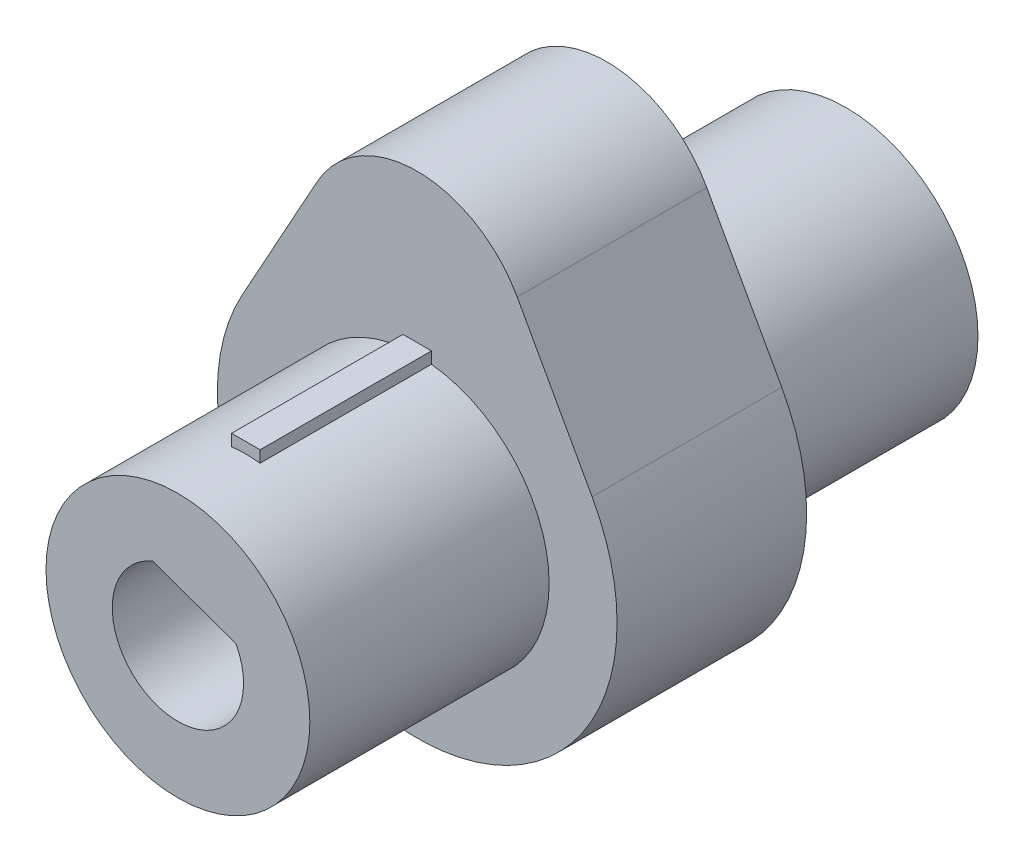
ISO-10303-21;
HEADER;
FILE_DESCRIPTION(('STEP AP214'),'2;1');
FILE_NAME('part.step','',(''),(''),'','','');
FILE_SCHEMA(('AUTOMOTIVE_DESIGN { 1 0 10303 214 1 1 1 1 }'));
ENDSEC;
DATA;
#1=APPLICATION_CONTEXT('core data for automotive mechanical design processes');
#2=APPLICATION_PROTOCOL_DEFINITION('international standard','automotive_design',2000,#1);
#3=PRODUCT_CONTEXT('',#1,'mechanical');
#4=PRODUCT('Part','Part','',(#3));
#5=PRODUCT_RELATED_PRODUCT_CATEGORY('part','',(#4));
#6=PRODUCT_DEFINITION_FORMATION('','',#4);
#7=PRODUCT_DEFINITION_CONTEXT('part definition',#1,'design');
#8=PRODUCT_DEFINITION('design','',#6,#7);
#9=PRODUCT_DEFINITION_SHAPE('','',#8);
#10=(LENGTH_UNIT() NAMED_UNIT(*) SI_UNIT(.MILLI.,.METRE.));
#11=(NAMED_UNIT(*) PLANE_ANGLE_UNIT() SI_UNIT($,.RADIAN.));
#12=(NAMED_UNIT(*) SI_UNIT($,.STERADIAN.) SOLID_ANGLE_UNIT());
#13=UNCERTAINTY_MEASURE_WITH_UNIT(LENGTH_MEASURE(1.E-05),#10,'distance_accuracy_value','');
#14=(GEOMETRIC_REPRESENTATION_CONTEXT(3) GLOBAL_UNCERTAINTY_ASSIGNED_CONTEXT((#13)) GLOBAL_UNIT_ASSIGNED_CONTEXT((#10,
#11,#12)) REPRESENTATION_CONTEXT('',''));
#15=CARTESIAN_POINT('',(0.,0.,0.));
#16=DIRECTION('',(0.,0.,1.));
#17=DIRECTION('',(1.,0.,0.));
#18=AXIS2_PLACEMENT_3D('',#15,#16,#17);
#19=CARTESIAN_POINT('',(3.88999442257959,2.1508064516129,-2.1082));
#20=DIRECTION('',(0.875139352661325,0.483870967741935,0.));
#21=DIRECTION('',(-0.483870967741935,0.875139352661325,0.));
#22=AXIS2_PLACEMENT_3D('',#19,#20,#21);
#23=PLANE('',#22);
#24=DIRECTION('',(0.,0.,1.));
#25=VECTOR('',#24,1.);
#26=CARTESIAN_POINT('',(3.88999442257959,2.1508064516129,-2.1082));
#27=LINE('',#26,#25);
#28=CARTESIAN_POINT('',(3.88999442257959,2.1508064516129,-2.1082));
#29=VERTEX_POINT('',#28);
#30=CARTESIAN_POINT('',(3.88999442257959,2.1508064516129,2.1082));
#31=VERTEX_POINT('',#30);
#32=EDGE_CURVE('E88',#29,#31,#27,.T.);
#33=ORIENTED_EDGE('',*,*,#32,.F.);
#34=DIRECTION('',(-0.483870967741935,0.875139352661325,0.));
#35=VECTOR('',#34,1.);
#36=CARTESIAN_POINT('',(3.8899944225796,2.15080645161289,-2.1082));
#37=LINE('',#36,#35);
#38=CARTESIAN_POINT('',(2.22285395575977,5.16603225806452,-2.1082));
#39=VERTEX_POINT('',#38);
#40=EDGE_CURVE('E91',#29,#39,#37,.T.);
#41=ORIENTED_EDGE('',*,*,#40,.T.);
#42=DIRECTION('',(0.,0.,1.));
#43=VECTOR('',#42,1.);
#44=CARTESIAN_POINT('',(2.22285395575977,5.16603225806451,-2.1082));
#45=LINE('',#44,#43);
#46=CARTESIAN_POINT('',(2.22285395575977,5.16603225806452,2.1082));
#47=VERTEX_POINT('',#46);
#48=EDGE_CURVE('E109',#47,#39,#45,.F.);
#49=ORIENTED_EDGE('',*,*,#48,.F.);
#50=DIRECTION('',(-0.483870967741935,0.875139352661325,0.));
#51=VECTOR('',#50,1.);
#52=CARTESIAN_POINT('',(3.8899944225796,2.15080645161289,2.1082));
#53=LINE('',#52,#51);
#54=EDGE_CURVE('E92',#31,#47,#53,.T.);
#55=ORIENTED_EDGE('',*,*,#54,.F.);
#56=EDGE_LOOP('',(#33,#41,#49,#55));
#57=FACE_BOUND('',#56,.T.);
#58=ADVANCED_FACE('F17',(#57),#23,.T.);
#59=CARTESIAN_POINT('',(0.,3.937,-2.1082));
#60=DIRECTION('',(0.,0.,1.));
#61=DIRECTION('',(1.,0.,0.));
#62=AXIS2_PLACEMENT_3D('',#59,#60,#61);
#63=CYLINDRICAL_SURFACE('',#62,2.54);
#64=ORIENTED_EDGE('',*,*,#48,.T.);
#65=CARTESIAN_POINT('',(0.,3.937,-2.1082));
#66=DIRECTION('',(0.,0.,1.));
#67=DIRECTION('',(1.,0.,0.));
#68=AXIS2_PLACEMENT_3D('',#65,#66,#67);
#69=CIRCLE('',#68,2.54);
#70=CARTESIAN_POINT('',(-2.22285395575977,5.16603225806452,-2.1082));
#71=VERTEX_POINT('',#70);
#72=EDGE_CURVE('E102',#39,#71,#69,.T.);
#73=ORIENTED_EDGE('',*,*,#72,.T.);
#74=DIRECTION('',(0.,0.,1.));
#75=VECTOR('',#74,1.);
#76=CARTESIAN_POINT('',(-2.22285395575977,5.16603225806452,-2.1082));
#77=LINE('',#76,#75);
#78=CARTESIAN_POINT('',(-2.22285395575977,5.16603225806452,2.1082));
#79=VERTEX_POINT('',#78);
#80=EDGE_CURVE('E94',#79,#71,#77,.F.);
#81=ORIENTED_EDGE('',*,*,#80,.F.);
#82=CARTESIAN_POINT('',(0.,3.937,2.1082));
#83=DIRECTION('',(0.,0.,1.));
#84=DIRECTION('',(1.,0.,0.));
#85=AXIS2_PLACEMENT_3D('',#82,#83,#84);
#86=CIRCLE('',#85,2.54);
#87=EDGE_CURVE('E138',#47,#79,#86,.T.);
#88=ORIENTED_EDGE('',*,*,#87,.F.);
#89=EDGE_LOOP('',(#64,#73,#81,#88));
#90=FACE_BOUND('',#89,.T.);
#91=ADVANCED_FACE('F349',(#90),#63,.T.);
#92=CARTESIAN_POINT('',(-2.22285395575977,5.16603225806452,-2.1082));
#93=DIRECTION('',(-0.875139352661325,0.483870967741935,0.));
#94=DIRECTION('',(-0.483870967741935,-0.875139352661325,0.));
#95=AXIS2_PLACEMENT_3D('',#92,#93,#94);
#96=PLANE('',#95);
#97=ORIENTED_EDGE('',*,*,#80,.T.);
#98=DIRECTION('',(-0.483870967741935,-0.875139352661325,0.));
#99=VECTOR('',#98,1.);
#100=CARTESIAN_POINT('',(-2.22285395575977,5.16603225806452,-2.1082));
#101=LINE('',#100,#99);
#102=CARTESIAN_POINT('',(-3.88999442257959,2.1508064516129,-2.1082));
#103=VERTEX_POINT('',#102);
#104=EDGE_CURVE('E139',#71,#103,#101,.T.);
#105=ORIENTED_EDGE('',*,*,#104,.T.);
#106=DIRECTION('',(0.,0.,1.));
#107=VECTOR('',#106,1.);
#108=CARTESIAN_POINT('',(-3.88999442257959,2.1508064516129,-2.1082));
#109=LINE('',#108,#107);
#110=CARTESIAN_POINT('',(-3.88999442257959,2.1508064516129,2.1082));
#111=VERTEX_POINT('',#110);
#112=EDGE_CURVE('E82',#111,#103,#109,.F.);
#113=ORIENTED_EDGE('',*,*,#112,.F.);
#114=DIRECTION('',(-0.483870967741935,-0.875139352661325,0.));
#115=VECTOR('',#114,1.);
#116=CARTESIAN_POINT('',(-2.22285395575977,5.16603225806452,2.1082));
#117=LINE('',#116,#115);
#118=EDGE_CURVE('E137',#79,#111,#117,.T.);
#119=ORIENTED_EDGE('',*,*,#118,.F.);
#120=EDGE_LOOP('',(#97,#105,#113,#119));
#121=FACE_BOUND('',#120,.T.);
#122=ADVANCED_FACE('F339',(#121),#96,.T.);
#123=CARTESIAN_POINT('',(0.,0.,-2.1082));
#124=DIRECTION('',(0.,0.,1.));
#125=DIRECTION('',(1.,0.,0.));
#126=AXIS2_PLACEMENT_3D('',#123,#124,#125);
#127=CYLINDRICAL_SURFACE('',#126,4.445);
#128=ORIENTED_EDGE('',*,*,#112,.T.);
#129=CARTESIAN_POINT('',(0.,0.,-2.1082));
#130=DIRECTION('',(0.,0.,1.));
#131=DIRECTION('',(1.,0.,0.));
#132=AXIS2_PLACEMENT_3D('',#129,#130,#131);
#133=CIRCLE('',#132,4.445);
#134=EDGE_CURVE('E20',#103,#29,#133,.T.);
#135=ORIENTED_EDGE('',*,*,#134,.T.);
#136=ORIENTED_EDGE('',*,*,#32,.T.);
#137=CARTESIAN_POINT('',(0.,0.,2.1082));
#138=DIRECTION('',(0.,0.,1.));
#139=DIRECTION('',(1.,0.,0.));
#140=AXIS2_PLACEMENT_3D('',#137,#138,#139);
#141=CIRCLE('',#140,4.445);
#142=EDGE_CURVE('E134',#111,#31,#141,.T.);
#143=ORIENTED_EDGE('',*,*,#142,.F.);
#144=EDGE_LOOP('',(#128,#135,#136,#143));
#145=FACE_BOUND('',#144,.T.);
#146=ADVANCED_FACE('F104',(#145),#127,.T.);
#147=CARTESIAN_POINT('',(0.,3.175,0.));
#148=DIRECTION('',(0.,1.,0.));
#149=DIRECTION('',(0.,0.,1.));
#150=AXIS2_PLACEMENT_3D('',#147,#148,#149);
#151=PLANE('',#150);
#152=DIRECTION('',(0.,0.,-1.));
#153=VECTOR('',#152,1.);
#154=CARTESIAN_POINT('',(0.3175,3.175,5.9182));
#155=LINE('',#154,#153);
#156=CARTESIAN_POINT('',(0.3175,3.175,2.1082));
#157=VERTEX_POINT('',#156);
#158=CARTESIAN_POINT('',(0.3175,3.175,5.9182));
#159=VERTEX_POINT('',#158);
#160=EDGE_CURVE('E166',#157,#159,#155,.F.);
#161=ORIENTED_EDGE('',*,*,#160,.F.);
#162=DIRECTION('',(1.,0.,0.));
#163=VECTOR('',#162,1.);
#164=CARTESIAN_POINT('',(0.,3.175,2.1082));
#165=LINE('',#164,#163);
#166=CARTESIAN_POINT('',(-0.3175,3.175,2.1082));
#167=VERTEX_POINT('',#166);
#168=EDGE_CURVE('E136',#167,#157,#165,.T.);
#169=ORIENTED_EDGE('',*,*,#168,.F.);
#170=DIRECTION('',(0.,0.,1.));
#171=VECTOR('',#170,1.);
#172=CARTESIAN_POINT('',(-0.3175,3.175,2.1082));
#173=LINE('',#172,#171);
#174=CARTESIAN_POINT('',(-0.3175,3.175,5.9182));
#175=VERTEX_POINT('',#174);
#176=EDGE_CURVE('E154',#175,#167,#173,.F.);
#177=ORIENTED_EDGE('',*,*,#176,.F.);
#178=DIRECTION('',(1.,0.,0.));
#179=VECTOR('',#178,1.);
#180=CARTESIAN_POINT('',(-0.3175,3.175,5.9182));
#181=LINE('',#180,#179);
#182=EDGE_CURVE('E160',#159,#175,#181,.F.);
#183=ORIENTED_EDGE('',*,*,#182,.F.);
#184=EDGE_LOOP('',(#161,#169,#177,#183));
#185=FACE_BOUND('',#184,.T.);
#186=ADVANCED_FACE('F318',(#185),#151,.T.);
#187=CARTESIAN_POINT('',(0.,0.,-2.1082));
#188=DIRECTION('',(0.,0.,1.));
#189=DIRECTION('',(1.,0.,0.));
#190=AXIS2_PLACEMENT_3D('',#187,#188,#189);
#191=PLANE('',#190);
#192=CARTESIAN_POINT('',(0.,0.,-2.1082));
#193=DIRECTION('',(0.,0.,1.));
#194=DIRECTION('',(1.,0.,0.));
#195=AXIS2_PLACEMENT_3D('',#192,#193,#194);
#196=CIRCLE('',#195,2.9337);
#197=CARTESIAN_POINT('',(2.9337,0.,-2.1082));
#198=VERTEX_POINT('',#197);
#199=EDGE_CURVE('E130',#198,#198,#196,.F.);
#200=ORIENTED_EDGE('',*,*,#199,.F.);
#201=EDGE_LOOP('',(#200));
#202=FACE_BOUND('',#201,.T.);
#203=ORIENTED_EDGE('',*,*,#72,.F.);
#204=ORIENTED_EDGE('',*,*,#40,.F.);
#205=ORIENTED_EDGE('',*,*,#134,.F.);
#206=ORIENTED_EDGE('',*,*,#104,.F.);
#207=EDGE_LOOP('',(#203,#204,#205,#206));
#208=FACE_BOUND('',#207,.T.);
#209=ADVANCED_FACE('F98',(#202,#208),#191,.F.);
#210=CARTESIAN_POINT('',(0.,0.,2.1082));
#211=DIRECTION('',(0.,0.,1.));
#212=DIRECTION('',(1.,0.,0.));
#213=AXIS2_PLACEMENT_3D('',#210,#211,#212);
#214=PLANE('',#213);
#215=DIRECTION('',(0.,1.,0.));
#216=VECTOR('',#215,1.);
#217=CARTESIAN_POINT('',(-0.3175,0.,2.1082));
#218=LINE('',#217,#216);
#219=CARTESIAN_POINT('',(-0.3175,2.91646865918357,2.1082));
#220=VERTEX_POINT('',#219);
#221=EDGE_CURVE('E133',#167,#220,#218,.F.);
#222=ORIENTED_EDGE('',*,*,#221,.F.);
#223=ORIENTED_EDGE('',*,*,#168,.T.);
#224=DIRECTION('',(0.,1.,0.));
#225=VECTOR('',#224,1.);
#226=CARTESIAN_POINT('',(0.3175,0.,2.1082));
#227=LINE('',#226,#225);
#228=CARTESIAN_POINT('',(0.3175,2.91646865918357,2.1082));
#229=VERTEX_POINT('',#228);
#230=EDGE_CURVE('E151',#229,#157,#227,.T.);
#231=ORIENTED_EDGE('',*,*,#230,.F.);
#232=CARTESIAN_POINT('',(0.,0.,2.1082));
#233=DIRECTION('',(0.,0.,1.));
#234=DIRECTION('',(1.,0.,0.));
#235=AXIS2_PLACEMENT_3D('',#232,#233,#234);
#236=CIRCLE('',#235,2.9337);
#237=EDGE_CURVE('E128',#220,#229,#236,.T.);
#238=ORIENTED_EDGE('',*,*,#237,.F.);
#239=EDGE_LOOP('',(#222,#223,#231,#238));
#240=FACE_BOUND('',#239,.T.);
#241=ORIENTED_EDGE('',*,*,#118,.T.);
#242=ORIENTED_EDGE('',*,*,#142,.T.);
#243=ORIENTED_EDGE('',*,*,#54,.T.);
#244=ORIENTED_EDGE('',*,*,#87,.T.);
#245=EDGE_LOOP('',(#241,#242,#243,#244));
#246=FACE_BOUND('',#245,.T.);
#247=ADVANCED_FACE('F299',(#240,#246),#214,.T.);
#248=CARTESIAN_POINT('',(0.3175,0.,5.9182));
#249=DIRECTION('',(1.,0.,0.));
#250=DIRECTION('',(0.,0.,-1.));
#251=AXIS2_PLACEMENT_3D('',#248,#249,#250);
#252=PLANE('',#251);
#253=DIRECTION('',(0.,1.,0.));
#254=VECTOR('',#253,1.);
#255=CARTESIAN_POINT('',(0.3175,0.,5.9182));
#256=LINE('',#255,#254);
#257=CARTESIAN_POINT('',(0.3175,2.91646865918357,5.9182));
#258=VERTEX_POINT('',#257);
#259=EDGE_CURVE('E163',#258,#159,#256,.T.);
#260=ORIENTED_EDGE('',*,*,#259,.F.);
#261=DIRECTION('',(0.,0.,1.));
#262=VECTOR('',#261,1.);
#263=CARTESIAN_POINT('',(0.3175,2.91646865918357,-7.4295));
#264=LINE('',#263,#262);
#265=EDGE_CURVE('E127',#229,#258,#264,.T.);
#266=ORIENTED_EDGE('',*,*,#265,.F.);
#267=ORIENTED_EDGE('',*,*,#230,.T.);
#268=ORIENTED_EDGE('',*,*,#160,.T.);
#269=EDGE_LOOP('',(#260,#266,#267,#268));
#270=FACE_BOUND('',#269,.T.);
#271=ADVANCED_FACE('F289',(#270),#252,.T.);
#272=CARTESIAN_POINT('',(-0.3175,0.,5.9182));
#273=DIRECTION('',(0.,0.,1.));
#274=DIRECTION('',(1.,0.,0.));
#275=AXIS2_PLACEMENT_3D('',#272,#273,#274);
#276=PLANE('',#275);
#277=DIRECTION('',(0.,1.,0.));
#278=VECTOR('',#277,1.);
#279=CARTESIAN_POINT('',(-0.3175,0.,5.9182));
#280=LINE('',#279,#278);
#281=CARTESIAN_POINT('',(-0.3175,2.91646865918357,5.9182));
#282=VERTEX_POINT('',#281);
#283=EDGE_CURVE('E157',#282,#175,#280,.T.);
#284=ORIENTED_EDGE('',*,*,#283,.F.);
#285=CARTESIAN_POINT('',(0.,0.,5.9182));
#286=DIRECTION('',(0.,0.,1.));
#287=DIRECTION('',(1.,0.,0.));
#288=AXIS2_PLACEMENT_3D('',#285,#286,#287);
#289=CIRCLE('',#288,2.9337);
#290=EDGE_CURVE('E125',#258,#282,#289,.T.);
#291=ORIENTED_EDGE('',*,*,#290,.F.);
#292=ORIENTED_EDGE('',*,*,#259,.T.);
#293=ORIENTED_EDGE('',*,*,#182,.T.);
#294=EDGE_LOOP('',(#284,#291,#292,#293));
#295=FACE_BOUND('',#294,.T.);
#296=ADVANCED_FACE('F199',(#295),#276,.T.);
#297=CARTESIAN_POINT('',(-0.3175,0.,2.1082));
#298=DIRECTION('',(-1.,0.,0.));
#299=DIRECTION('',(0.,0.,1.));
#300=AXIS2_PLACEMENT_3D('',#297,#298,#299);
#301=PLANE('',#300);
#302=ORIENTED_EDGE('',*,*,#221,.T.);
#303=DIRECTION('',(0.,0.,1.));
#304=VECTOR('',#303,1.);
#305=CARTESIAN_POINT('',(-0.3175,2.91646865918357,-7.4295));
#306=LINE('',#305,#304);
#307=EDGE_CURVE('E124',#282,#220,#306,.F.);
#308=ORIENTED_EDGE('',*,*,#307,.F.);
#309=ORIENTED_EDGE('',*,*,#283,.T.);
#310=ORIENTED_EDGE('',*,*,#176,.T.);
#311=EDGE_LOOP('',(#302,#308,#309,#310));
#312=FACE_BOUND('',#311,.T.);
#313=ADVANCED_FACE('F189',(#312),#301,.T.);
#314=CARTESIAN_POINT('',(0.,0.,-7.4295));
#315=DIRECTION('',(0.,0.,1.));
#316=DIRECTION('',(1.,0.,0.));
#317=AXIS2_PLACEMENT_3D('',#314,#315,#316);
#318=CYLINDRICAL_SURFACE('',#317,2.9337);
#319=CARTESIAN_POINT('',(0.,0.,-7.4295));
#320=DIRECTION('',(0.,0.,1.));
#321=DIRECTION('',(1.,0.,0.));
#322=AXIS2_PLACEMENT_3D('',#319,#320,#321);
#323=CIRCLE('',#322,2.9337);
#324=CARTESIAN_POINT('',(2.9337,0.,-7.4295));
#325=VERTEX_POINT('',#324);
#326=EDGE_CURVE('E121',#325,#325,#323,.T.);
#327=ORIENTED_EDGE('',*,*,#326,.T.);
#328=EDGE_LOOP('',(#327));
#329=FACE_BOUND('',#328,.T.);
#330=ORIENTED_EDGE('',*,*,#199,.T.);
#331=EDGE_LOOP('',(#330));
#332=FACE_BOUND('',#331,.T.);
#333=ADVANCED_FACE('F227',(#329,#332),#318,.T.);
#334=CARTESIAN_POINT('',(0.,0.,-7.4295));
#335=DIRECTION('',(0.,0.,1.));
#336=DIRECTION('',(1.,0.,0.));
#337=AXIS2_PLACEMENT_3D('',#334,#335,#336);
#338=CYLINDRICAL_SURFACE('',#337,2.9337);
#339=CARTESIAN_POINT('',(0.,0.,7.4295));
#340=DIRECTION('',(0.,0.,1.));
#341=DIRECTION('',(1.,0.,0.));
#342=AXIS2_PLACEMENT_3D('',#339,#340,#341);
#343=CIRCLE('',#342,2.9337);
#344=CARTESIAN_POINT('',(2.9337,0.,7.4295));
#345=VERTEX_POINT('',#344);
#346=EDGE_CURVE('E117',#345,#345,#343,.T.);
#347=ORIENTED_EDGE('',*,*,#346,.F.);
#348=EDGE_LOOP('',(#347));
#349=FACE_BOUND('',#348,.T.);
#350=ORIENTED_EDGE('',*,*,#290,.T.);
#351=ORIENTED_EDGE('',*,*,#307,.T.);
#352=ORIENTED_EDGE('',*,*,#237,.T.);
#353=ORIENTED_EDGE('',*,*,#265,.T.);
#354=EDGE_LOOP('',(#350,#351,#352,#353));
#355=FACE_BOUND('',#354,.T.);
#356=ADVANCED_FACE('F195',(#349,#355),#338,.T.);
#357=CARTESIAN_POINT('',(0.,0.,-7.4295));
#358=DIRECTION('',(0.,0.,1.));
#359=DIRECTION('',(1.,0.,0.));
#360=AXIS2_PLACEMENT_3D('',#357,#358,#359);
#361=PLANE('',#360);
#362=DIRECTION('',(-0.939692620785909,0.342020143325669,0.));
#363=VECTOR('',#362,1.);
#364=CARTESIAN_POINT('',(1.29362186791795,0.67794005106977,-7.42950000000001));
#365=LINE('',#364,#363);
#366=CARTESIAN_POINT('',(1.29362186791795,0.67794005106977,-7.4295));
#367=VERTEX_POINT('',#366);
#368=CARTESIAN_POINT('',(-0.555200378477828,1.35085631720701,-7.4295));
#369=VERTEX_POINT('',#368);
#370=EDGE_CURVE('E120',#367,#369,#365,.T.);
#371=ORIENTED_EDGE('',*,*,#370,.T.);
#372=CARTESIAN_POINT('',(0.,0.,-7.4295));
#373=DIRECTION('',(0.,0.,1.));
#374=DIRECTION('',(1.,0.,0.));
#375=AXIS2_PLACEMENT_3D('',#372,#373,#374);
#376=CIRCLE('',#375,1.4605);
#377=EDGE_CURVE('E114',#369,#367,#376,.T.);
#378=ORIENTED_EDGE('',*,*,#377,.T.);
#379=EDGE_LOOP('',(#371,#378));
#380=FACE_BOUND('',#379,.T.);
#381=ORIENTED_EDGE('',*,*,#326,.F.);
#382=EDGE_LOOP('',(#381));
#383=FACE_BOUND('',#382,.T.);
#384=ADVANCED_FACE('F217',(#380,#383),#361,.F.);
#385=CARTESIAN_POINT('',(0.,0.,7.4295));
#386=DIRECTION('',(0.,0.,1.));
#387=DIRECTION('',(1.,0.,0.));
#388=AXIS2_PLACEMENT_3D('',#385,#386,#387);
#389=PLANE('',#388);
#390=CARTESIAN_POINT('',(0.,0.,7.4295));
#391=DIRECTION('',(0.,0.,1.));
#392=DIRECTION('',(1.,0.,0.));
#393=AXIS2_PLACEMENT_3D('',#390,#391,#392);
#394=CIRCLE('',#393,1.4605);
#395=CARTESIAN_POINT('',(1.29362186791795,0.67794005106977,7.4295));
#396=VERTEX_POINT('',#395);
#397=CARTESIAN_POINT('',(-0.555200378477828,1.35085631720701,7.4295));
#398=VERTEX_POINT('',#397);
#399=EDGE_CURVE('E26',#396,#398,#394,.F.);
#400=ORIENTED_EDGE('',*,*,#399,.T.);
#401=DIRECTION('',(-0.939692620785909,0.342020143325669,0.));
#402=VECTOR('',#401,1.);
#403=CARTESIAN_POINT('',(1.29362186791795,0.67794005106977,7.4295));
#404=LINE('',#403,#402);
#405=EDGE_CURVE('E34',#398,#396,#404,.F.);
#406=ORIENTED_EDGE('',*,*,#405,.T.);
#407=EDGE_LOOP('',(#400,#406));
#408=FACE_BOUND('',#407,.T.);
#409=ORIENTED_EDGE('',*,*,#346,.T.);
#410=EDGE_LOOP('',(#409));
#411=FACE_BOUND('',#410,.T.);
#412=ADVANCED_FACE('F220',(#408,#411),#389,.T.);
#413=CARTESIAN_POINT('',(1.29362186791795,0.67794005106977,8.9154));
#414=DIRECTION('',(0.342020143325669,0.939692620785909,0.));
#415=DIRECTION('',(-0.939692620785909,0.342020143325669,0.));
#416=AXIS2_PLACEMENT_3D('',#413,#414,#415);
#417=PLANE('',#416);
#418=ORIENTED_EDGE('',*,*,#405,.F.);
#419=DIRECTION('',(0.,0.,1.));
#420=VECTOR('',#419,1.);
#421=CARTESIAN_POINT('',(-0.555200378477828,1.35085631720701,8.9154));
#422=LINE('',#421,#420);
#423=EDGE_CURVE('E11',#398,#369,#422,.F.);
#424=ORIENTED_EDGE('',*,*,#423,.T.);
#425=ORIENTED_EDGE('',*,*,#370,.F.);
#426=DIRECTION('',(0.,0.,1.));
#427=VECTOR('',#426,1.);
#428=CARTESIAN_POINT('',(1.29362186791795,0.677940051069769,8.9154));
#429=LINE('',#428,#427);
#430=EDGE_CURVE('E113',#367,#396,#429,.T.);
#431=ORIENTED_EDGE('',*,*,#430,.T.);
#432=EDGE_LOOP('',(#418,#424,#425,#431));
#433=FACE_BOUND('',#432,.T.);
#434=ADVANCED_FACE('F212',(#433),#417,.F.);
#435=CARTESIAN_POINT('',(0.,0.,8.9154));
#436=DIRECTION('',(0.,0.,1.));
#437=DIRECTION('',(1.,0.,0.));
#438=AXIS2_PLACEMENT_3D('',#435,#436,#437);
#439=CYLINDRICAL_SURFACE('',#438,1.4605);
#440=ORIENTED_EDGE('',*,*,#399,.F.);
#441=ORIENTED_EDGE('',*,*,#430,.F.);
#442=ORIENTED_EDGE('',*,*,#377,.F.);
#443=ORIENTED_EDGE('',*,*,#423,.F.);
#444=EDGE_LOOP('',(#440,#441,#442,#443));
#445=FACE_BOUND('',#444,.T.);
#446=ADVANCED_FACE('F215',(#445),#439,.F.);
#447=CLOSED_SHELL('',(#58,#91,#122,#146,#186,#209,#247,#271,#296,#313,#333,#356,#384,#412,#434,#446));
#448=MANIFOLD_SOLID_BREP('B1',#447);
#449=ADVANCED_BREP_SHAPE_REPRESENTATION('',(#18,#448),#14);
#450=SHAPE_DEFINITION_REPRESENTATION(#9,#449);
ENDSEC;
END-ISO-10303-21;
